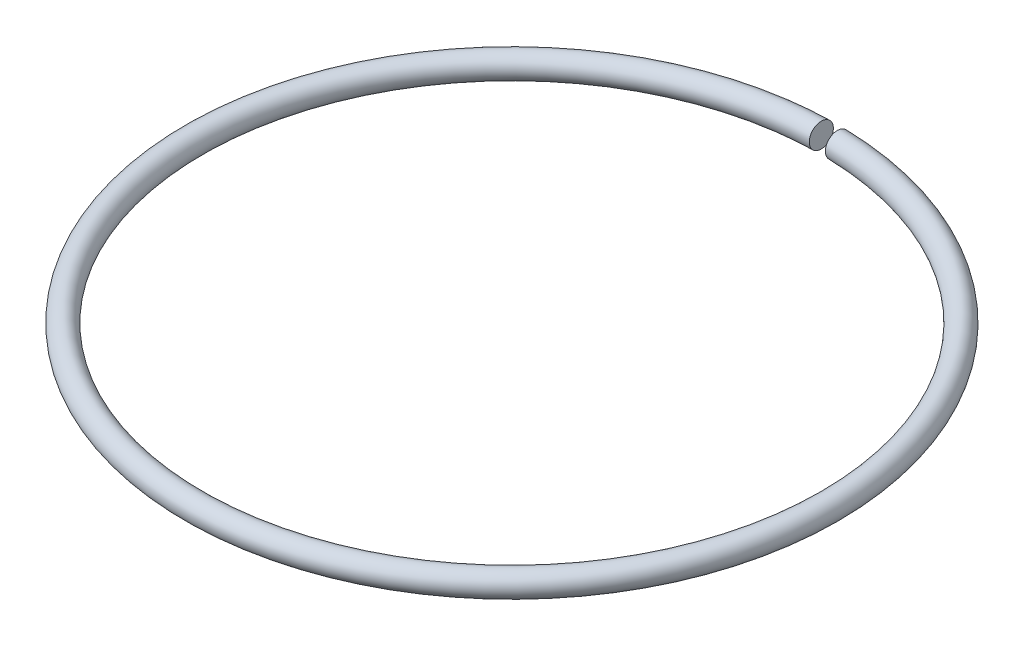
ISO-10303-21;
HEADER;
FILE_DESCRIPTION(('STEP AP214'),'2;1');
FILE_NAME('part.step','',(''),(''),'','','');
FILE_SCHEMA(('AUTOMOTIVE_DESIGN { 1 0 10303 214 1 1 1 1 }'));
ENDSEC;
DATA;
#1=APPLICATION_CONTEXT('core data for automotive mechanical design processes');
#2=APPLICATION_PROTOCOL_DEFINITION('international standard','automotive_design',2000,#1);
#3=PRODUCT_CONTEXT('',#1,'mechanical');
#4=PRODUCT('Part','Part','',(#3));
#5=PRODUCT_RELATED_PRODUCT_CATEGORY('part','',(#4));
#6=PRODUCT_DEFINITION_FORMATION('','',#4);
#7=PRODUCT_DEFINITION_CONTEXT('part definition',#1,'design');
#8=PRODUCT_DEFINITION('design','',#6,#7);
#9=PRODUCT_DEFINITION_SHAPE('','',#8);
#10=(LENGTH_UNIT() NAMED_UNIT(*) SI_UNIT(.MILLI.,.METRE.));
#11=(NAMED_UNIT(*) PLANE_ANGLE_UNIT() SI_UNIT($,.RADIAN.));
#12=(NAMED_UNIT(*) SI_UNIT($,.STERADIAN.) SOLID_ANGLE_UNIT());
#13=UNCERTAINTY_MEASURE_WITH_UNIT(LENGTH_MEASURE(1.E-05),#10,'distance_accuracy_value','');
#14=(GEOMETRIC_REPRESENTATION_CONTEXT(3) GLOBAL_UNCERTAINTY_ASSIGNED_CONTEXT((#13)) GLOBAL_UNIT_ASSIGNED_CONTEXT((#10,
#11,#12)) REPRESENTATION_CONTEXT('',''));
#15=CARTESIAN_POINT('',(0.,0.,0.));
#16=DIRECTION('',(0.,0.,1.));
#17=DIRECTION('',(1.,0.,0.));
#18=AXIS2_PLACEMENT_3D('',#15,#16,#17);
#19=CARTESIAN_POINT('',(0.,0.,0.));
#20=DIRECTION('',(0.,-1.,0.));
#21=DIRECTION('',(0.,0.,-1.));
#22=AXIS2_PLACEMENT_3D('',#19,#20,#21);
#23=TOROIDAL_SURFACE('',#22,39.5,1.5);
#24=CARTESIAN_POINT('',(-1.,-0.948693590905328,-40.6495882125183));
#25=CARTESIAN_POINT('',(-1.,-0.88344424000296,-40.7028763480125));
#26=CARTESIAN_POINT('',(-1.,-0.813648104446061,-40.7506940075303));
#27=CARTESIAN_POINT('',(-1.,-0.666959846984555,-40.8339714023128));
#28=CARTESIAN_POINT('',(-1.,-0.590059304367796,-40.8694162283465));
#29=CARTESIAN_POINT('',(-1.,-0.431426895045427,-40.9268749854473));
#30=CARTESIAN_POINT('',(-1.,-0.349697306974904,-40.9488951964108));
#31=CARTESIAN_POINT('',(-1.,-0.183723360706833,-40.9788928957027));
#32=CARTESIAN_POINT('',(-1.,-0.0994796316458151,-40.9868738677256));
#33=CARTESIAN_POINT('',(-1.,0.0691501634603645,-40.9885788976411));
#34=CARTESIAN_POINT('',(-1.,0.153536225592913,-40.9823033412509));
#35=CARTESIAN_POINT('',(-1.,0.320060113935506,-40.9556734846838));
#36=CARTESIAN_POINT('',(-1.,0.402197852865665,-40.9353186387526));
#37=CARTESIAN_POINT('',(-1.,0.561887860353963,-40.8811094065365));
#38=CARTESIAN_POINT('',(-1.,0.639440271942918,-40.847255441587));
#39=CARTESIAN_POINT('',(-1.,0.787761888981017,-40.7670102303609));
#40=CARTESIAN_POINT('',(-1.,0.858531103650813,-40.7206190011269));
#41=CARTESIAN_POINT('',(-1.,0.991290808226613,-40.616608356816));
#42=CARTESIAN_POINT('',(-1.,1.05327981508314,-40.5589870487823));
#43=CARTESIAN_POINT('',(-1.,1.16670741047265,-40.4341579273604));
#44=CARTESIAN_POINT('',(-1.,1.21814600295045,-40.3669501175567));
#45=CARTESIAN_POINT('',(-1.,1.30902830125086,-40.2248355688647));
#46=CARTESIAN_POINT('',(-1.,1.34846862298803,-40.149926665856));
#47=CARTESIAN_POINT('',(-1.,1.41421746413393,-39.9945518839713));
#48=CARTESIAN_POINT('',(-1.,1.44052594814657,-39.9140859901174));
#49=CARTESIAN_POINT('',(-1.,1.47927157235275,-39.7498570885334));
#50=CARTESIAN_POINT('',(-1.,1.49170479240819,-39.6660931559345));
#51=CARTESIAN_POINT('',(-1.,1.50233452609625,-39.4976667855841));
#52=CARTESIAN_POINT('',(-1.,1.50053102878661,-39.4130043471419));
#53=CARTESIAN_POINT('',(-1.,1.4827371019949,-39.2451696526287));
#54=CARTESIAN_POINT('',(-1.,1.46674435804811,-39.1619976419253));
#55=CARTESIAN_POINT('',(-1.,1.42102202240618,-38.9995191684792));
#56=CARTESIAN_POINT('',(-1.,1.3912924268911,-38.9202127068115));
#57=CARTESIAN_POINT('',(-1.,1.31894040530631,-38.7677202051845));
#58=CARTESIAN_POINT('',(-0.999999999999999,1.27631844136788,-38.6945339459646));
#59=CARTESIAN_POINT('',(-0.999999999999999,1.17938987501298,-38.5563579667229));
#60=CARTESIAN_POINT('',(-0.999999999999999,1.12508328500951,-38.4913682379938));
#61=CARTESIAN_POINT('',(-0.999999999999999,1.00633995851922,-38.3714466830503));
#62=CARTESIAN_POINT('',(-0.999999999999999,0.941905558392614,-38.3165125434471));
#63=CARTESIAN_POINT('',(-0.999999999999999,0.804726078684182,-38.2182458306803));
#64=CARTESIAN_POINT('',(-0.999999999999999,0.73198101347519,-38.1749132374528));
#65=CARTESIAN_POINT('',(-0.999999999999999,0.580270804055135,-38.1010947361));
#66=CARTESIAN_POINT('',(-0.999999999999999,0.501307709044512,-38.0706046164937));
#67=CARTESIAN_POINT('',(-0.999999999999999,0.339382613610682,-38.0233180471155));
#68=CARTESIAN_POINT('',(-0.999999999999999,0.256420620557023,-38.0065215721086));
#69=CARTESIAN_POINT('',(-0.999999999999999,0.088877199018982,-37.9871030043428));
#70=CARTESIAN_POINT('',(-0.999999999999999,0.00429622172878059,-37.9844770185109));
#71=CARTESIAN_POINT('',(-0.999999999999999,-0.164105883989134,-37.9934636552881));
#72=CARTESIAN_POINT('',(-0.999999999999999,-0.247927012731641,-38.0050762719981));
#73=CARTESIAN_POINT('',(-0.999999999999999,-0.412422430269865,-38.0422080616392));
#74=CARTESIAN_POINT('',(-0.999999999999999,-0.493096994845036,-38.0677260128942));
#75=CARTESIAN_POINT('',(-0.999999999999999,-0.64901776676131,-38.1319419349204));
#76=CARTESIAN_POINT('',(-0.999999999999999,-0.72426397727555,-38.1706398979871));
#77=CARTESIAN_POINT('',(-0.999999999999999,-0.86720407152338,-38.2601223034699));
#78=CARTESIAN_POINT('',(-0.999999999999999,-0.934896886265339,-38.3109084534838));
#79=CARTESIAN_POINT('',(-0.999999999999999,-1.06079882538653,-38.4231215103663));
#80=CARTESIAN_POINT('',(-0.999999999999999,-1.11900791834959,-38.4845484524827));
#81=CARTESIAN_POINT('',(-0.999999999999999,-1.22430872838682,-38.6163188394847));
#82=CARTESIAN_POINT('',(-1.,-1.27139710620262,-38.6866649528427));
#83=CARTESIAN_POINT('',(-1.,-1.35309989100147,-38.8342623470994));
#84=CARTESIAN_POINT('',(-1.,-1.38771425033742,-38.9115136543726));
#85=CARTESIAN_POINT('',(-1.,-1.44349792717251,-39.0707562066686));
#86=CARTESIAN_POINT('',(-1.,-1.4646627243917,-39.1527490351847));
#87=CARTESIAN_POINT('',(-1.,-1.49292845315174,-39.3191208445858));
#88=CARTESIAN_POINT('',(-1.,-1.50002991836258,-39.4034997348021));
#89=CARTESIAN_POINT('',(-1.,-1.49996988760466,-39.572259129632));
#90=CARTESIAN_POINT('',(-1.,-1.49280718879635,-39.6566396337817));
#91=CARTESIAN_POINT('',(-1.,-1.46441349579898,-39.823023243861));
#92=CARTESIAN_POINT('',(-1.,-1.44317900354018,-39.9050257533594));
#93=CARTESIAN_POINT('',(-1.,-1.38723476943473,-40.0643316282047));
#94=CARTESIAN_POINT('',(-1.,-1.35251880549942,-40.1416328046694));
#95=CARTESIAN_POINT('',(-1.,-1.27061773956941,-40.2892366332457));
#96=CARTESIAN_POINT('',(-1.,-1.22344769525427,-40.3595475965456));
#97=CARTESIAN_POINT('',(-1.,-1.13781267151999,-40.4665058610881));
#98=CARTESIAN_POINT('',(-1.,-1.10271078876637,-40.5058936952979));
#99=CARTESIAN_POINT('',(-1.,-1.02856378146351,-40.5807642709556));
#100=CARTESIAN_POINT('',(-1.,-0.989518657056394,-40.6162470125442));
#101=CARTESIAN_POINT('',(-1.,-0.948693590905328,-40.6495882125183));
#102=B_SPLINE_CURVE_WITH_KNOTS('',3,(#24,#25,#26,#27,#28,#29,#30,#31,#32,#33,#34,#35,#36,#37,
#38,#39,#40,#41,#42,#43,#44,#45,#46,#47,#48,#49,#50,#51,#52,#53,#54,#55,#56,#57,#58,#59,#60,#61,
#62,#63,#64,#65,#66,#67,#68,#69,#70,#71,#72,#73,#74,#75,#76,#77,#78,#79,#80,#81,#82,#83,#84,#85,
#86,#87,#88,#89,#90,#91,#92,#93,#94,#95,#96,#97,#98,#99,#100,#101),.UNSPECIFIED.,.T.,.F.,(4,2,2,
2,2,2,2,2,2,2,2,2,2,2,2,2,2,2,2,2,2,2,2,2,2,2,2,2,2,2,2,2,2,2,2,2,2,2,4),(0.,0.252540586399711,
0.505384441477655,0.758109927867226,1.01077269414277,1.26342862458947,1.51609434926674,
1.76875218834086,2.02140968396289,2.27410980475674,2.52680983106529,2.77958106491215,
3.0323529800851,3.28519629210888,3.5380397984667,3.79092455472291,4.04380938130125,
4.29668514421179,4.54956063848417,4.80237788290106,5.05519469009118,5.30792852543675,
5.56066189503829,5.81332582740674,6.06598965509582,6.31863128816629,6.57127277355426,
6.82394996870983,7.07662800087735,7.32938180942002,7.58213658339786,7.83497626117433,
8.08780634410272,8.34065774807739,8.59357203130104,8.84660318076721,9.09932979134286,
9.25733881939645,9.41534784175475),.UNSPECIFIED.);
#103=CARTESIAN_POINT('',(-1.,-0.948693590905328,-40.6495882125183));
#104=VERTEX_POINT('',#103);
#105=EDGE_CURVE('E10',#104,#104,#102,.T.);
#106=ORIENTED_EDGE('',*,*,#105,.F.);
#107=EDGE_LOOP('',(#106));
#108=FACE_BOUND('',#107,.T.);
#109=CARTESIAN_POINT('',(0.999999999999999,-0.948693590905328,-40.6495882125183));
#110=CARTESIAN_POINT('',(0.999999999999999,-1.01396542767678,-40.5962720596878));
#111=CARTESIAN_POINT('',(0.999999999999999,-1.0747813554411,-40.5374035157543));
#112=CARTESIAN_POINT('',(0.999999999999999,-1.18571504161372,-40.4102407824424));
#113=CARTESIAN_POINT('',(1.,-1.23581978863291,-40.3419352934277));
#114=CARTESIAN_POINT('',(1.,-1.32382877711729,-40.1979083459331));
#115=CARTESIAN_POINT('',(1.,-1.36173898143758,-40.1221905356077));
#116=CARTESIAN_POINT('',(1.,-1.42430107318645,-39.9654865875638));
#117=CARTESIAN_POINT('',(1.,-1.44895625275579,-39.8845017636161));
#118=CARTESIAN_POINT('',(1.,-1.48433257300247,-39.7195174633252));
#119=CARTESIAN_POINT('',(1.,-1.49504945567026,-39.6355170738064));
#120=CARTESIAN_POINT('',(1.,-1.502231315647,-39.4669059835365));
#121=CARTESIAN_POINT('',(1.,-1.49869571645166,-39.3822952582359));
#122=CARTESIAN_POINT('',(1.,-1.47747038379891,-39.2148565720396));
#123=CARTESIAN_POINT('',(1.,-1.45977875564894,-39.1320288513115));
#124=CARTESIAN_POINT('',(1.,-1.41074041547792,-38.9705195542892));
#125=CARTESIAN_POINT('',(1.,-1.37939372978942,-38.8918379699998));
#126=CARTESIAN_POINT('',(1.,-1.30393565665911,-38.7408588069307));
#127=CARTESIAN_POINT('',(1.,-1.25982486653524,-38.6685609296211));
#128=CARTESIAN_POINT('',(1.,-1.16008893886243,-38.53239933843));
#129=CARTESIAN_POINT('',(1.,-1.10446383460003,-38.4685356001672));
#130=CARTESIAN_POINT('',(1.,-0.983292058401904,-38.3510718588923));
#131=CARTESIAN_POINT('',(1.,-0.917747765872488,-38.2974694013786));
#132=CARTESIAN_POINT('',(1.,-0.778587835841114,-38.2020335050332));
#133=CARTESIAN_POINT('',(1.,-0.704972204288428,-38.1602000575267));
#134=CARTESIAN_POINT('',(1.,-0.551785418849735,-38.0895043078769));
#135=CARTESIAN_POINT('',(1.,-0.472216237315366,-38.0606377319401));
#136=CARTESIAN_POINT('',(1.,-0.309360272340628,-38.0166768653859));
#137=CARTESIAN_POINT('',(1.,-0.226073496652716,-38.0015825460499));
#138=CARTESIAN_POINT('',(1.,-0.0581703413303101,-37.9855978989625));
#139=CARTESIAN_POINT('',(1.,0.0264456782796189,-37.9847037892966));
#140=CARTESIAN_POINT('',(1.,0.194626593120673,-37.997135268888));
#141=CARTESIAN_POINT('',(1.,0.278191488997926,-38.010460849404));
#142=CARTESIAN_POINT('',(1.,0.441891721348307,-38.0509510610335));
#143=CARTESIAN_POINT('',(1.,0.522027312343835,-38.0781146631537));
#144=CARTESIAN_POINT('',(1.,0.676601718948574,-38.1455079164067));
#145=CARTESIAN_POINT('',(1.,0.751040531698265,-38.185737574098));
#146=CARTESIAN_POINT('',(1.,0.892121153566395,-38.2781267528009));
#147=CARTESIAN_POINT('',(1.,0.958761756457922,-38.3302881157312));
#148=CARTESIAN_POINT('',(1.,1.08234333710461,-38.445055347758));
#149=CARTESIAN_POINT('',(1.,1.13928429935126,-38.5076612335539));
#150=CARTESIAN_POINT('',(1.,1.24186903814237,-38.6415607679551));
#151=CARTESIAN_POINT('',(1.,1.28750933779312,-38.7128570803151));
#152=CARTESIAN_POINT('',(1.,1.36617688905215,-38.8620982312127));
#153=CARTESIAN_POINT('',(1.,1.39920411956438,-38.9400430808701));
#154=CARTESIAN_POINT('',(1.,1.45171836369492,-39.1003949542166));
#155=CARTESIAN_POINT('',(1.,1.47120113528997,-39.1828033671577));
#156=CARTESIAN_POINT('',(1.,1.49605772026088,-39.3497212933498));
#157=CARTESIAN_POINT('',(1.,1.5014315105628,-39.4342308100366));
#158=CARTESIAN_POINT('',(1.,1.49791739282297,-39.602967946704));
#159=CARTESIAN_POINT('',(1.,1.48902694426447,-39.6871955137908));
#160=CARTESIAN_POINT('',(1.,1.45723128923622,-39.8529624521979));
#161=CARTESIAN_POINT('',(1.,1.43432609539868,-39.9345018259412));
#162=CARTESIAN_POINT('',(1.,1.37515082595435,-40.0925748988774));
#163=CARTESIAN_POINT('',(1.,1.33888113084354,-40.169108740508));
#164=CARTESIAN_POINT('',(1.,1.25400493256143,-40.3149993649566));
#165=CARTESIAN_POINT('',(0.999999999999999,1.20539841846104,-40.3843561414166));
#166=CARTESIAN_POINT('',(0.999999999999999,1.09723899764122,-40.5139075266103));
#167=CARTESIAN_POINT('',(0.999999999999999,1.03768841683197,-40.57410407718));
#168=CARTESIAN_POINT('',(0.999999999999999,0.909323585865518,-40.6836415925747));
#169=CARTESIAN_POINT('',(0.999999999999999,0.840509331499131,-40.7329825524671));
#170=CARTESIAN_POINT('',(0.999999999999999,0.69559117997719,-40.8193934485484));
#171=CARTESIAN_POINT('',(0.999999999999999,0.619489308152408,-40.8564667813945));
#172=CARTESIAN_POINT('',(0.999999999999999,0.462143409632969,-40.9173054978532));
#173=CARTESIAN_POINT('',(0.999999999999999,0.380899592957932,-40.9410714246089));
#174=CARTESIAN_POINT('',(0.999999999999999,0.215605102666326,-40.9746158682261));
#175=CARTESIAN_POINT('',(0.999999999999999,0.131555455164782,-40.9843994424237));
#176=CARTESIAN_POINT('',(0.999999999999999,-0.0370162779177649,-40.9897162624945));
#177=CARTESIAN_POINT('',(0.999999999999999,-0.121538475401424,-40.9852459767487));
#178=CARTESIAN_POINT('',(0.999999999999999,-0.288655103449634,-40.9621763263906));
#179=CARTESIAN_POINT('',(0.999999999999999,-0.371248826353345,-40.9435718566356));
#180=CARTESIAN_POINT('',(0.999999999999999,-0.532067259019688,-40.8927654066538));
#181=CARTESIAN_POINT('',(0.999999999999999,-0.610297106975531,-40.8605798170477));
#182=CARTESIAN_POINT('',(0.999999999999999,-0.732011583589114,-40.7980640370216));
#183=CARTESIAN_POINT('',(0.999999999999999,-0.777511829865519,-40.7715760492706));
#184=CARTESIAN_POINT('',(0.999999999999999,-0.865484457987141,-40.7139756864525));
#185=CARTESIAN_POINT('',(0.999999999999999,-0.907956839990581,-40.6828633116272));
#186=CARTESIAN_POINT('',(0.999999999999999,-0.948693590905328,-40.6495882125183));
#187=B_SPLINE_CURVE_WITH_KNOTS('',3,(#109,#110,#111,#112,#113,#114,#115,#116,#117,#118,#119,
#120,#121,#122,#123,#124,#125,#126,#127,#128,#129,#130,#131,#132,#133,#134,#135,#136,#137,#138,
#139,#140,#141,#142,#143,#144,#145,#146,#147,#148,#149,#150,#151,#152,#153,#154,#155,#156,#157,
#158,#159,#160,#161,#162,#163,#164,#165,#166,#167,#168,#169,#170,#171,#172,#173,#174,#175,#176,
#177,#178,#179,#180,#181,#182,#183,#184,#185,#186),.UNSPECIFIED.,.T.,.F.,(4,2,2,2,2,2,2,2,2,2,2,
2,2,2,2,2,2,2,2,2,2,2,2,2,2,2,2,2,2,2,2,2,2,2,2,2,2,2,4),(0.,0.252646273136807,
0.505597725593392,0.758425301833532,1.01119005443057,1.2640320059949,1.516884184966,
1.76977021222137,2.02265575181086,2.27552945910566,2.52840243538221,2.78121484857619,
3.03402707542686,3.28675591582186,3.53948422921524,3.7921452328374,4.04480608114064,
4.29744814436123,4.55009033439565,4.80277155160629,5.0554531728188,5.30821244067255,
5.56097213127848,5.81381094870989,6.06665017963577,6.31953444721706,6.57241848686117,
6.82529532728936,7.0781723917396,7.3309957749946,7.58381927312669,7.83657271086943,
8.0893158317052,8.34196751365812,8.59468179891771,8.84748740577254,9.09998877831697,
9.25766763868317,9.41534649080972),.UNSPECIFIED.);
#188=CARTESIAN_POINT('',(0.999999999999999,-0.948693590905328,-40.6495882125183));
#189=VERTEX_POINT('',#188);
#190=EDGE_CURVE('E40',#189,#189,#187,.T.);
#191=ORIENTED_EDGE('',*,*,#190,.F.);
#192=EDGE_LOOP('',(#191));
#193=FACE_BOUND('',#192,.T.);
#194=ADVANCED_FACE('F31',(#108,#193),#23,.T.);
#195=CARTESIAN_POINT('',(0.999999999999999,-1.5,-42.8091046040974));
#196=DIRECTION('',(1.,0.,0.));
#197=DIRECTION('',(0.,0.,-1.));
#198=AXIS2_PLACEMENT_3D('',#195,#196,#197);
#199=PLANE('',#198);
#200=ORIENTED_EDGE('',*,*,#190,.T.);
#201=EDGE_LOOP('',(#200));
#202=FACE_BOUND('',#201,.T.);
#203=ADVANCED_FACE('F49',(#202),#199,.F.);
#204=CARTESIAN_POINT('',(-1.,-1.5,-42.8091046040974));
#205=DIRECTION('',(-1.,0.,0.));
#206=DIRECTION('',(0.,0.,1.));
#207=AXIS2_PLACEMENT_3D('',#204,#205,#206);
#208=PLANE('',#207);
#209=ORIENTED_EDGE('',*,*,#105,.T.);
#210=EDGE_LOOP('',(#209));
#211=FACE_BOUND('',#210,.T.);
#212=ADVANCED_FACE('F52',(#211),#208,.F.);
#213=CLOSED_SHELL('',(#194,#203,#212));
#214=MANIFOLD_SOLID_BREP('B2',#213);
#215=ADVANCED_BREP_SHAPE_REPRESENTATION('',(#18,#214),#14);
#216=SHAPE_DEFINITION_REPRESENTATION(#9,#215);
ENDSEC;
END-ISO-10303-21;
